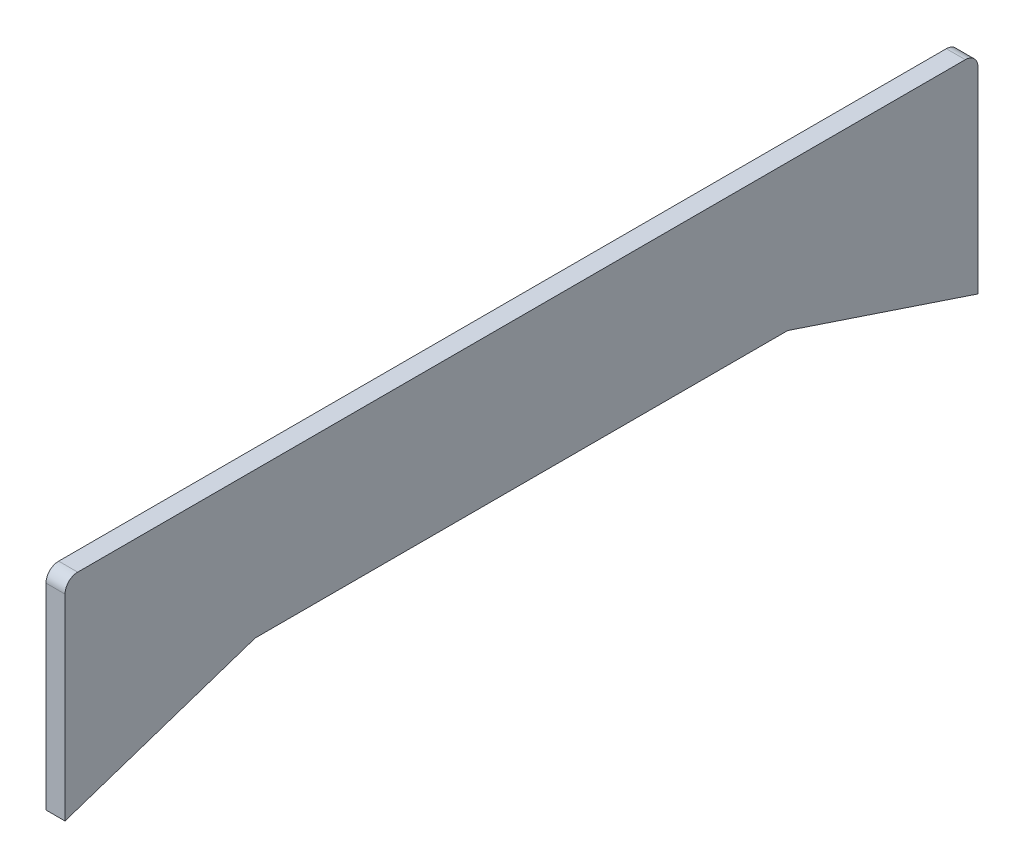
ISO-10303-21;
HEADER;
FILE_DESCRIPTION(('STEP AP214'),'2;1');
FILE_NAME('part.step','',(''),(''),'','','');
FILE_SCHEMA(('AUTOMOTIVE_DESIGN { 1 0 10303 214 1 1 1 1 }'));
ENDSEC;
DATA;
#1=APPLICATION_CONTEXT('core data for automotive mechanical design processes');
#2=APPLICATION_PROTOCOL_DEFINITION('international standard','automotive_design',2000,#1);
#3=PRODUCT_CONTEXT('',#1,'mechanical');
#4=PRODUCT('Part','Part','',(#3));
#5=PRODUCT_RELATED_PRODUCT_CATEGORY('part','',(#4));
#6=PRODUCT_DEFINITION_FORMATION('','',#4);
#7=PRODUCT_DEFINITION_CONTEXT('part definition',#1,'design');
#8=PRODUCT_DEFINITION('design','',#6,#7);
#9=PRODUCT_DEFINITION_SHAPE('','',#8);
#10=(LENGTH_UNIT() NAMED_UNIT(*) SI_UNIT(.MILLI.,.METRE.));
#11=(NAMED_UNIT(*) PLANE_ANGLE_UNIT() SI_UNIT($,.RADIAN.));
#12=(NAMED_UNIT(*) SI_UNIT($,.STERADIAN.) SOLID_ANGLE_UNIT());
#13=UNCERTAINTY_MEASURE_WITH_UNIT(LENGTH_MEASURE(1.E-05),#10,'distance_accuracy_value','');
#14=(GEOMETRIC_REPRESENTATION_CONTEXT(3) GLOBAL_UNCERTAINTY_ASSIGNED_CONTEXT((#13)) GLOBAL_UNIT_ASSIGNED_CONTEXT((#10,
#11,#12)) REPRESENTATION_CONTEXT('',''));
#15=CARTESIAN_POINT('',(0.,0.,0.));
#16=DIRECTION('',(0.,0.,1.));
#17=DIRECTION('',(1.,0.,0.));
#18=AXIS2_PLACEMENT_3D('',#15,#16,#17);
#19=CARTESIAN_POINT('',(3.,-11.5,72.));
#20=DIRECTION('',(0.,1.,0.));
#21=DIRECTION('',(0.,0.,1.));
#22=AXIS2_PLACEMENT_3D('',#19,#20,#21);
#23=PLANE('',#22);
#24=DIRECTION('',(0.,0.,-1.));
#25=VECTOR('',#24,1.);
#26=CARTESIAN_POINT('',(0.,-11.5,72.));
#27=LINE('',#26,#25);
#28=CARTESIAN_POINT('',(0.,-11.5,42.));
#29=VERTEX_POINT('',#28);
#30=CARTESIAN_POINT('',(0.,-11.5,-42.));
#31=VERTEX_POINT('',#30);
#32=EDGE_CURVE('E57',#29,#31,#27,.T.);
#33=ORIENTED_EDGE('',*,*,#32,.T.);
#34=DIRECTION('',(1.,0.,0.));
#35=VECTOR('',#34,1.);
#36=CARTESIAN_POINT('',(0.,-11.5,-42.));
#37=LINE('',#36,#35);
#38=CARTESIAN_POINT('',(3.,-11.5,-42.));
#39=VERTEX_POINT('',#38);
#40=EDGE_CURVE('E52',#31,#39,#37,.T.);
#41=ORIENTED_EDGE('',*,*,#40,.T.);
#42=DIRECTION('',(0.,0.,-1.));
#43=VECTOR('',#42,1.);
#44=CARTESIAN_POINT('',(3.,-11.5,72.));
#45=LINE('',#44,#43);
#46=CARTESIAN_POINT('',(3.,-11.5,42.));
#47=VERTEX_POINT('',#46);
#48=EDGE_CURVE('E122',#47,#39,#45,.T.);
#49=ORIENTED_EDGE('',*,*,#48,.F.);
#50=DIRECTION('',(1.,0.,0.));
#51=VECTOR('',#50,1.);
#52=CARTESIAN_POINT('',(0.,-11.5,42.));
#53=LINE('',#52,#51);
#54=EDGE_CURVE('E133',#29,#47,#53,.T.);
#55=ORIENTED_EDGE('',*,*,#54,.F.);
#56=EDGE_LOOP('',(#33,#41,#49,#55));
#57=FACE_BOUND('',#56,.T.);
#58=ADVANCED_FACE('F37',(#57),#23,.F.);
#59=CARTESIAN_POINT('',(3.,-11.5,-72.));
#60=DIRECTION('',(0.,0.,1.));
#61=DIRECTION('',(1.,0.,0.));
#62=AXIS2_PLACEMENT_3D('',#59,#60,#61);
#63=PLANE('',#62);
#64=DIRECTION('',(0.,1.,0.));
#65=VECTOR('',#64,1.);
#66=CARTESIAN_POINT('',(0.,-11.5,-72.));
#67=LINE('',#66,#65);
#68=CARTESIAN_POINT('',(0.,-21.5,-72.));
#69=VERTEX_POINT('',#68);
#70=CARTESIAN_POINT('',(0.,9.5,-72.));
#71=VERTEX_POINT('',#70);
#72=EDGE_CURVE('E136',#69,#71,#67,.T.);
#73=ORIENTED_EDGE('',*,*,#72,.T.);
#74=DIRECTION('',(-1.,0.,0.));
#75=VECTOR('',#74,1.);
#76=CARTESIAN_POINT('',(3.,9.5,-72.));
#77=LINE('',#76,#75);
#78=CARTESIAN_POINT('',(3.,9.5,-72.));
#79=VERTEX_POINT('',#78);
#80=EDGE_CURVE('E107',#71,#79,#77,.F.);
#81=ORIENTED_EDGE('',*,*,#80,.T.);
#82=DIRECTION('',(0.,1.,0.));
#83=VECTOR('',#82,1.);
#84=CARTESIAN_POINT('',(3.,-11.5,-72.));
#85=LINE('',#84,#83);
#86=CARTESIAN_POINT('',(3.,-21.5,-72.));
#87=VERTEX_POINT('',#86);
#88=EDGE_CURVE('E100',#87,#79,#85,.T.);
#89=ORIENTED_EDGE('',*,*,#88,.F.);
#90=DIRECTION('',(1.,0.,0.));
#91=VECTOR('',#90,1.);
#92=CARTESIAN_POINT('',(0.,-21.5,-72.));
#93=LINE('',#92,#91);
#94=EDGE_CURVE('E104',#69,#87,#93,.T.);
#95=ORIENTED_EDGE('',*,*,#94,.F.);
#96=EDGE_LOOP('',(#73,#81,#89,#95));
#97=FACE_BOUND('',#96,.T.);
#98=ADVANCED_FACE('F103',(#97),#63,.F.);
#99=CARTESIAN_POINT('',(3.,11.5,72.));
#100=DIRECTION('',(0.,-1.,0.));
#101=DIRECTION('',(0.,0.,-1.));
#102=AXIS2_PLACEMENT_3D('',#99,#100,#101);
#103=PLANE('',#102);
#104=DIRECTION('',(0.,0.,1.));
#105=VECTOR('',#104,1.);
#106=CARTESIAN_POINT('',(3.,11.5,72.));
#107=LINE('',#106,#105);
#108=CARTESIAN_POINT('',(3.,11.5,-70.));
#109=VERTEX_POINT('',#108);
#110=CARTESIAN_POINT('',(3.,11.5,70.));
#111=VERTEX_POINT('',#110);
#112=EDGE_CURVE('E111',#109,#111,#107,.T.);
#113=ORIENTED_EDGE('',*,*,#112,.F.);
#114=DIRECTION('',(-1.,0.,0.));
#115=VECTOR('',#114,1.);
#116=CARTESIAN_POINT('',(3.,11.5,-70.));
#117=LINE('',#116,#115);
#118=CARTESIAN_POINT('',(0.,11.5,-70.));
#119=VERTEX_POINT('',#118);
#120=EDGE_CURVE('E153',#109,#119,#117,.T.);
#121=ORIENTED_EDGE('',*,*,#120,.T.);
#122=DIRECTION('',(0.,0.,1.));
#123=VECTOR('',#122,1.);
#124=CARTESIAN_POINT('',(0.,11.5,72.));
#125=LINE('',#124,#123);
#126=CARTESIAN_POINT('',(0.,11.5,70.));
#127=VERTEX_POINT('',#126);
#128=EDGE_CURVE('E146',#119,#127,#125,.T.);
#129=ORIENTED_EDGE('',*,*,#128,.T.);
#130=DIRECTION('',(-1.,0.,0.));
#131=VECTOR('',#130,1.);
#132=CARTESIAN_POINT('',(3.,11.5,70.));
#133=LINE('',#132,#131);
#134=EDGE_CURVE('E144',#127,#111,#133,.F.);
#135=ORIENTED_EDGE('',*,*,#134,.T.);
#136=EDGE_LOOP('',(#113,#121,#129,#135));
#137=FACE_BOUND('',#136,.T.);
#138=ADVANCED_FACE('F167',(#137),#103,.F.);
#139=CARTESIAN_POINT('',(3.,-11.5,72.));
#140=DIRECTION('',(0.,0.,-1.));
#141=DIRECTION('',(-1.,0.,0.));
#142=AXIS2_PLACEMENT_3D('',#139,#140,#141);
#143=PLANE('',#142);
#144=DIRECTION('',(0.,-1.,0.));
#145=VECTOR('',#144,1.);
#146=CARTESIAN_POINT('',(3.,-11.5,72.));
#147=LINE('',#146,#145);
#148=CARTESIAN_POINT('',(3.,9.5,72.));
#149=VERTEX_POINT('',#148);
#150=CARTESIAN_POINT('',(3.,-21.5,72.));
#151=VERTEX_POINT('',#150);
#152=EDGE_CURVE('E141',#149,#151,#147,.T.);
#153=ORIENTED_EDGE('',*,*,#152,.F.);
#154=DIRECTION('',(-1.,0.,0.));
#155=VECTOR('',#154,1.);
#156=CARTESIAN_POINT('',(3.,9.5,72.));
#157=LINE('',#156,#155);
#158=CARTESIAN_POINT('',(0.,9.5,72.));
#159=VERTEX_POINT('',#158);
#160=EDGE_CURVE('E11',#149,#159,#157,.T.);
#161=ORIENTED_EDGE('',*,*,#160,.T.);
#162=DIRECTION('',(0.,-1.,0.));
#163=VECTOR('',#162,1.);
#164=CARTESIAN_POINT('',(0.,-11.5,72.));
#165=LINE('',#164,#163);
#166=CARTESIAN_POINT('',(0.,-21.5,72.));
#167=VERTEX_POINT('',#166);
#168=EDGE_CURVE('E149',#159,#167,#165,.T.);
#169=ORIENTED_EDGE('',*,*,#168,.T.);
#170=DIRECTION('',(1.,0.,0.));
#171=VECTOR('',#170,1.);
#172=CARTESIAN_POINT('',(0.,-21.5,72.));
#173=LINE('',#172,#171);
#174=EDGE_CURVE('E131',#167,#151,#173,.T.);
#175=ORIENTED_EDGE('',*,*,#174,.T.);
#176=EDGE_LOOP('',(#153,#161,#169,#175));
#177=FACE_BOUND('',#176,.T.);
#178=ADVANCED_FACE('F178',(#177),#143,.F.);
#179=CARTESIAN_POINT('',(3.,0.,0.));
#180=DIRECTION('',(-1.,0.,0.));
#181=DIRECTION('',(0.,0.,1.));
#182=AXIS2_PLACEMENT_3D('',#179,#180,#181);
#183=PLANE('',#182);
#184=ORIENTED_EDGE('',*,*,#88,.T.);
#185=CARTESIAN_POINT('',(3.,9.5,-70.));
#186=DIRECTION('',(-1.,0.,0.));
#187=DIRECTION('',(0.,0.,1.));
#188=AXIS2_PLACEMENT_3D('',#185,#186,#187);
#189=CIRCLE('',#188,2.);
#190=EDGE_CURVE('E45',#79,#109,#189,.F.);
#191=ORIENTED_EDGE('',*,*,#190,.T.);
#192=ORIENTED_EDGE('',*,*,#112,.T.);
#193=CARTESIAN_POINT('',(3.,9.5,70.));
#194=DIRECTION('',(-1.,0.,0.));
#195=DIRECTION('',(0.,0.,1.));
#196=AXIS2_PLACEMENT_3D('',#193,#194,#195);
#197=CIRCLE('',#196,2.);
#198=EDGE_CURVE('E161',#111,#149,#197,.F.);
#199=ORIENTED_EDGE('',*,*,#198,.T.);
#200=ORIENTED_EDGE('',*,*,#152,.T.);
#201=DIRECTION('',(0.,0.316227766016838,-0.948683298050514));
#202=VECTOR('',#201,1.);
#203=CARTESIAN_POINT('',(3.,-21.5,72.));
#204=LINE('',#203,#202);
#205=EDGE_CURVE('E123',#151,#47,#204,.T.);
#206=ORIENTED_EDGE('',*,*,#205,.T.);
#207=ORIENTED_EDGE('',*,*,#48,.T.);
#208=DIRECTION('',(0.,-0.316227766016838,-0.948683298050514));
#209=VECTOR('',#208,1.);
#210=CARTESIAN_POINT('',(3.,-21.5,-72.));
#211=LINE('',#210,#209);
#212=EDGE_CURVE('E116',#39,#87,#211,.T.);
#213=ORIENTED_EDGE('',*,*,#212,.T.);
#214=EDGE_LOOP('',(#184,#191,#192,#199,#200,#206,#207,#213));
#215=FACE_BOUND('',#214,.T.);
#216=ADVANCED_FACE('F120',(#215),#183,.F.);
#217=CARTESIAN_POINT('',(0.,0.,0.));
#218=DIRECTION('',(-1.,0.,0.));
#219=DIRECTION('',(0.,0.,1.));
#220=AXIS2_PLACEMENT_3D('',#217,#218,#219);
#221=PLANE('',#220);
#222=ORIENTED_EDGE('',*,*,#128,.F.);
#223=CARTESIAN_POINT('',(0.,9.5,-70.));
#224=DIRECTION('',(-1.,0.,0.));
#225=DIRECTION('',(0.,0.,1.));
#226=AXIS2_PLACEMENT_3D('',#223,#224,#225);
#227=CIRCLE('',#226,2.);
#228=EDGE_CURVE('E158',#119,#71,#227,.T.);
#229=ORIENTED_EDGE('',*,*,#228,.T.);
#230=ORIENTED_EDGE('',*,*,#72,.F.);
#231=DIRECTION('',(0.,-0.316227766016838,-0.948683298050514));
#232=VECTOR('',#231,1.);
#233=CARTESIAN_POINT('',(0.,-21.5,-72.));
#234=LINE('',#233,#232);
#235=EDGE_CURVE('E118',#31,#69,#234,.T.);
#236=ORIENTED_EDGE('',*,*,#235,.F.);
#237=ORIENTED_EDGE('',*,*,#32,.F.);
#238=DIRECTION('',(0.,0.316227766016838,-0.948683298050514));
#239=VECTOR('',#238,1.);
#240=CARTESIAN_POINT('',(0.,-21.5,72.));
#241=LINE('',#240,#239);
#242=EDGE_CURVE('E125',#167,#29,#241,.T.);
#243=ORIENTED_EDGE('',*,*,#242,.F.);
#244=ORIENTED_EDGE('',*,*,#168,.F.);
#245=CARTESIAN_POINT('',(0.,9.5,70.));
#246=DIRECTION('',(-1.,0.,0.));
#247=DIRECTION('',(0.,0.,1.));
#248=AXIS2_PLACEMENT_3D('',#245,#246,#247);
#249=CIRCLE('',#248,2.);
#250=EDGE_CURVE('E156',#159,#127,#249,.T.);
#251=ORIENTED_EDGE('',*,*,#250,.T.);
#252=EDGE_LOOP('',(#222,#229,#230,#236,#237,#243,#244,#251));
#253=FACE_BOUND('',#252,.T.);
#254=ADVANCED_FACE('F172',(#253),#221,.T.);
#255=CARTESIAN_POINT('',(3.,9.5,-70.));
#256=DIRECTION('',(-1.,0.,0.));
#257=DIRECTION('',(0.,0.,1.));
#258=AXIS2_PLACEMENT_3D('',#255,#256,#257);
#259=CYLINDRICAL_SURFACE('',#258,2.);
#260=ORIENTED_EDGE('',*,*,#190,.F.);
#261=ORIENTED_EDGE('',*,*,#80,.F.);
#262=ORIENTED_EDGE('',*,*,#228,.F.);
#263=ORIENTED_EDGE('',*,*,#120,.F.);
#264=EDGE_LOOP('',(#260,#261,#262,#263));
#265=FACE_BOUND('',#264,.T.);
#266=ADVANCED_FACE('F170',(#265),#259,.T.);
#267=CARTESIAN_POINT('',(3.,9.5,70.));
#268=DIRECTION('',(-1.,0.,0.));
#269=DIRECTION('',(0.,0.,1.));
#270=AXIS2_PLACEMENT_3D('',#267,#268,#269);
#271=CYLINDRICAL_SURFACE('',#270,2.);
#272=ORIENTED_EDGE('',*,*,#198,.F.);
#273=ORIENTED_EDGE('',*,*,#134,.F.);
#274=ORIENTED_EDGE('',*,*,#250,.F.);
#275=ORIENTED_EDGE('',*,*,#160,.F.);
#276=EDGE_LOOP('',(#272,#273,#274,#275));
#277=FACE_BOUND('',#276,.T.);
#278=ADVANCED_FACE('F39',(#277),#271,.T.);
#279=CARTESIAN_POINT('',(0.,-21.5,72.));
#280=DIRECTION('',(0.,-0.948683298050514,-0.316227766016838));
#281=DIRECTION('',(0.,0.316227766016838,-0.948683298050514));
#282=AXIS2_PLACEMENT_3D('',#279,#280,#281);
#283=PLANE('',#282);
#284=ORIENTED_EDGE('',*,*,#205,.F.);
#285=ORIENTED_EDGE('',*,*,#174,.F.);
#286=ORIENTED_EDGE('',*,*,#242,.T.);
#287=ORIENTED_EDGE('',*,*,#54,.T.);
#288=EDGE_LOOP('',(#284,#285,#286,#287));
#289=FACE_BOUND('',#288,.T.);
#290=ADVANCED_FACE('F183',(#289),#283,.T.);
#291=CARTESIAN_POINT('',(0.,-21.5,-72.));
#292=DIRECTION('',(0.,-0.948683298050514,0.316227766016838));
#293=DIRECTION('',(0.,-0.316227766016838,-0.948683298050514));
#294=AXIS2_PLACEMENT_3D('',#291,#292,#293);
#295=PLANE('',#294);
#296=ORIENTED_EDGE('',*,*,#212,.F.);
#297=ORIENTED_EDGE('',*,*,#40,.F.);
#298=ORIENTED_EDGE('',*,*,#235,.T.);
#299=ORIENTED_EDGE('',*,*,#94,.T.);
#300=EDGE_LOOP('',(#296,#297,#298,#299));
#301=FACE_BOUND('',#300,.T.);
#302=ADVANCED_FACE('F115',(#301),#295,.T.);
#303=CLOSED_SHELL('',(#58,#98,#138,#178,#216,#254,#266,#278,#290,#302));
#304=MANIFOLD_SOLID_BREP('B2',#303);
#305=ADVANCED_BREP_SHAPE_REPRESENTATION('',(#18,#304),#14);
#306=SHAPE_DEFINITION_REPRESENTATION(#9,#305);
ENDSEC;
END-ISO-10303-21;
